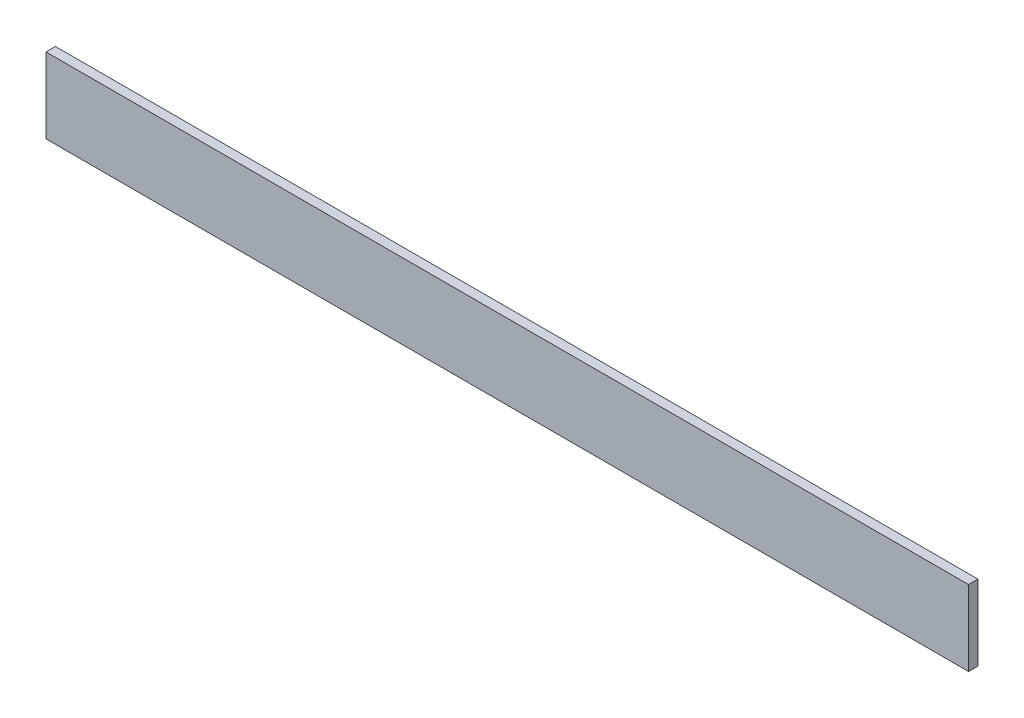
ISO-10303-21;
HEADER;
FILE_DESCRIPTION(('STEP AP214'),'2;1');
FILE_NAME('part.step','',(''),(''),'','','');
FILE_SCHEMA(('AUTOMOTIVE_DESIGN { 1 0 10303 214 1 1 1 1 }'));
ENDSEC;
DATA;
#1=APPLICATION_CONTEXT('core data for automotive mechanical design processes');
#2=APPLICATION_PROTOCOL_DEFINITION('international standard','automotive_design',2000,#1);
#3=PRODUCT_CONTEXT('',#1,'mechanical');
#4=PRODUCT('Part','Part','',(#3));
#5=PRODUCT_RELATED_PRODUCT_CATEGORY('part','',(#4));
#6=PRODUCT_DEFINITION_FORMATION('','',#4);
#7=PRODUCT_DEFINITION_CONTEXT('part definition',#1,'design');
#8=PRODUCT_DEFINITION('design','',#6,#7);
#9=PRODUCT_DEFINITION_SHAPE('','',#8);
#10=(LENGTH_UNIT() NAMED_UNIT(*) SI_UNIT(.MILLI.,.METRE.));
#11=(NAMED_UNIT(*) PLANE_ANGLE_UNIT() SI_UNIT($,.RADIAN.));
#12=(NAMED_UNIT(*) SI_UNIT($,.STERADIAN.) SOLID_ANGLE_UNIT());
#13=UNCERTAINTY_MEASURE_WITH_UNIT(LENGTH_MEASURE(1.E-05),#10,'distance_accuracy_value','');
#14=(GEOMETRIC_REPRESENTATION_CONTEXT(3) GLOBAL_UNCERTAINTY_ASSIGNED_CONTEXT((#13)) GLOBAL_UNIT_ASSIGNED_CONTEXT((#10,
#11,#12)) REPRESENTATION_CONTEXT('',''));
#15=CARTESIAN_POINT('',(0.,0.,0.));
#16=DIRECTION('',(0.,0.,1.));
#17=DIRECTION('',(1.,0.,0.));
#18=AXIS2_PLACEMENT_3D('',#15,#16,#17);
#19=CARTESIAN_POINT('',(-933.45,-76.2000000000001,19.05));
#20=DIRECTION('',(1.,0.,0.));
#21=DIRECTION('',(0.,0.,-1.));
#22=AXIS2_PLACEMENT_3D('',#19,#20,#21);
#23=PLANE('',#22);
#24=DIRECTION('',(0.,-1.,0.));
#25=VECTOR('',#24,1.);
#26=CARTESIAN_POINT('',(-933.45,-76.2000000000001,0.));
#27=LINE('',#26,#25);
#28=CARTESIAN_POINT('',(-933.45,76.1999999999999,0.));
#29=VERTEX_POINT('',#28);
#30=CARTESIAN_POINT('',(-933.45,-76.2000000000001,0.));
#31=VERTEX_POINT('',#30);
#32=EDGE_CURVE('E95',#29,#31,#27,.T.);
#33=ORIENTED_EDGE('',*,*,#32,.T.);
#34=DIRECTION('',(0.,0.,-1.));
#35=VECTOR('',#34,1.);
#36=CARTESIAN_POINT('',(-933.45,-76.2000000000001,19.05));
#37=LINE('',#36,#35);
#38=CARTESIAN_POINT('',(-933.45,-76.2000000000001,19.05));
#39=VERTEX_POINT('',#38);
#40=EDGE_CURVE('E11',#39,#31,#37,.T.);
#41=ORIENTED_EDGE('',*,*,#40,.F.);
#42=DIRECTION('',(0.,-1.,0.));
#43=VECTOR('',#42,1.);
#44=CARTESIAN_POINT('',(-933.45,-76.2000000000001,19.05));
#45=LINE('',#44,#43);
#46=CARTESIAN_POINT('',(-933.45,76.1999999999999,19.05));
#47=VERTEX_POINT('',#46);
#48=EDGE_CURVE('E83',#47,#39,#45,.T.);
#49=ORIENTED_EDGE('',*,*,#48,.F.);
#50=DIRECTION('',(0.,0.,-1.));
#51=VECTOR('',#50,1.);
#52=CARTESIAN_POINT('',(-933.45,76.1999999999999,19.05));
#53=LINE('',#52,#51);
#54=EDGE_CURVE('E91',#47,#29,#53,.T.);
#55=ORIENTED_EDGE('',*,*,#54,.T.);
#56=EDGE_LOOP('',(#33,#41,#49,#55));
#57=FACE_BOUND('',#56,.T.);
#58=ADVANCED_FACE('F32',(#57),#23,.F.);
#59=CARTESIAN_POINT('',(933.45,-76.1999999999999,19.05));
#60=DIRECTION('',(0.,1.,0.));
#61=DIRECTION('',(-1.,0.,0.));
#62=AXIS2_PLACEMENT_3D('',#59,#60,#61);
#63=PLANE('',#62);
#64=DIRECTION('',(1.,0.,0.));
#65=VECTOR('',#64,1.);
#66=CARTESIAN_POINT('',(933.45,-76.1999999999999,0.));
#67=LINE('',#66,#65);
#68=CARTESIAN_POINT('',(933.45,-76.1999999999999,0.));
#69=VERTEX_POINT('',#68);
#70=EDGE_CURVE('E87',#31,#69,#67,.T.);
#71=ORIENTED_EDGE('',*,*,#70,.T.);
#72=DIRECTION('',(0.,0.,-1.));
#73=VECTOR('',#72,1.);
#74=CARTESIAN_POINT('',(933.45,-76.1999999999999,19.05));
#75=LINE('',#74,#73);
#76=CARTESIAN_POINT('',(933.45,-76.1999999999999,19.05));
#77=VERTEX_POINT('',#76);
#78=EDGE_CURVE('E40',#77,#69,#75,.T.);
#79=ORIENTED_EDGE('',*,*,#78,.F.);
#80=DIRECTION('',(1.,0.,0.));
#81=VECTOR('',#80,1.);
#82=CARTESIAN_POINT('',(933.45,-76.1999999999999,19.05));
#83=LINE('',#82,#81);
#84=EDGE_CURVE('E78',#39,#77,#83,.T.);
#85=ORIENTED_EDGE('',*,*,#84,.F.);
#86=ORIENTED_EDGE('',*,*,#40,.T.);
#87=EDGE_LOOP('',(#71,#79,#85,#86));
#88=FACE_BOUND('',#87,.T.);
#89=ADVANCED_FACE('F86',(#88),#63,.F.);
#90=CARTESIAN_POINT('',(933.45,-76.1999999999999,19.05));
#91=DIRECTION('',(-1.,0.,0.));
#92=DIRECTION('',(0.,0.,1.));
#93=AXIS2_PLACEMENT_3D('',#90,#91,#92);
#94=PLANE('',#93);
#95=DIRECTION('',(0.,1.,0.));
#96=VECTOR('',#95,1.);
#97=CARTESIAN_POINT('',(933.45,-76.1999999999999,0.));
#98=LINE('',#97,#96);
#99=CARTESIAN_POINT('',(933.45,76.2000000000001,0.));
#100=VERTEX_POINT('',#99);
#101=EDGE_CURVE('E65',#69,#100,#98,.T.);
#102=ORIENTED_EDGE('',*,*,#101,.T.);
#103=DIRECTION('',(0.,0.,-1.));
#104=VECTOR('',#103,1.);
#105=CARTESIAN_POINT('',(933.45,76.2000000000001,19.05));
#106=LINE('',#105,#104);
#107=CARTESIAN_POINT('',(933.45,76.2000000000001,19.05));
#108=VERTEX_POINT('',#107);
#109=EDGE_CURVE('E88',#108,#100,#106,.T.);
#110=ORIENTED_EDGE('',*,*,#109,.F.);
#111=DIRECTION('',(0.,1.,0.));
#112=VECTOR('',#111,1.);
#113=CARTESIAN_POINT('',(933.45,-76.1999999999999,19.05));
#114=LINE('',#113,#112);
#115=EDGE_CURVE('E81',#77,#108,#114,.T.);
#116=ORIENTED_EDGE('',*,*,#115,.F.);
#117=ORIENTED_EDGE('',*,*,#78,.T.);
#118=EDGE_LOOP('',(#102,#110,#116,#117));
#119=FACE_BOUND('',#118,.T.);
#120=ADVANCED_FACE('F89',(#119),#94,.F.);
#121=CARTESIAN_POINT('',(933.45,76.2000000000001,19.05));
#122=DIRECTION('',(0.,-1.,0.));
#123=DIRECTION('',(1.,0.,0.));
#124=AXIS2_PLACEMENT_3D('',#121,#122,#123);
#125=PLANE('',#124);
#126=DIRECTION('',(-1.,0.,0.));
#127=VECTOR('',#126,1.);
#128=CARTESIAN_POINT('',(933.45,76.2000000000001,0.));
#129=LINE('',#128,#127);
#130=EDGE_CURVE('E71',#100,#29,#129,.T.);
#131=ORIENTED_EDGE('',*,*,#130,.T.);
#132=ORIENTED_EDGE('',*,*,#54,.F.);
#133=DIRECTION('',(-1.,0.,0.));
#134=VECTOR('',#133,1.);
#135=CARTESIAN_POINT('',(933.45,76.2000000000001,19.05));
#136=LINE('',#135,#134);
#137=EDGE_CURVE('E48',#108,#47,#136,.T.);
#138=ORIENTED_EDGE('',*,*,#137,.F.);
#139=ORIENTED_EDGE('',*,*,#109,.T.);
#140=EDGE_LOOP('',(#131,#132,#138,#139));
#141=FACE_BOUND('',#140,.T.);
#142=ADVANCED_FACE('F102',(#141),#125,.F.);
#143=CARTESIAN_POINT('',(0.,0.,19.05));
#144=DIRECTION('',(0.,0.,1.));
#145=DIRECTION('',(1.,0.,0.));
#146=AXIS2_PLACEMENT_3D('',#143,#144,#145);
#147=PLANE('',#146);
#148=ORIENTED_EDGE('',*,*,#48,.T.);
#149=ORIENTED_EDGE('',*,*,#84,.T.);
#150=ORIENTED_EDGE('',*,*,#115,.T.);
#151=ORIENTED_EDGE('',*,*,#137,.T.);
#152=EDGE_LOOP('',(#148,#149,#150,#151));
#153=FACE_BOUND('',#152,.T.);
#154=ADVANCED_FACE('F79',(#153),#147,.T.);
#155=CARTESIAN_POINT('',(0.,0.,0.));
#156=DIRECTION('',(0.,0.,1.));
#157=DIRECTION('',(1.,0.,0.));
#158=AXIS2_PLACEMENT_3D('',#155,#156,#157);
#159=PLANE('',#158);
#160=ORIENTED_EDGE('',*,*,#32,.F.);
#161=ORIENTED_EDGE('',*,*,#130,.F.);
#162=ORIENTED_EDGE('',*,*,#101,.F.);
#163=ORIENTED_EDGE('',*,*,#70,.F.);
#164=EDGE_LOOP('',(#160,#161,#162,#163));
#165=FACE_BOUND('',#164,.T.);
#166=ADVANCED_FACE('F105',(#165),#159,.F.);
#167=CLOSED_SHELL('',(#58,#89,#120,#142,#154,#166));
#168=MANIFOLD_SOLID_BREP('B2',#167);
#169=ADVANCED_BREP_SHAPE_REPRESENTATION('',(#18,#168),#14);
#170=SHAPE_DEFINITION_REPRESENTATION(#9,#169);
ENDSEC;
END-ISO-10303-21;
